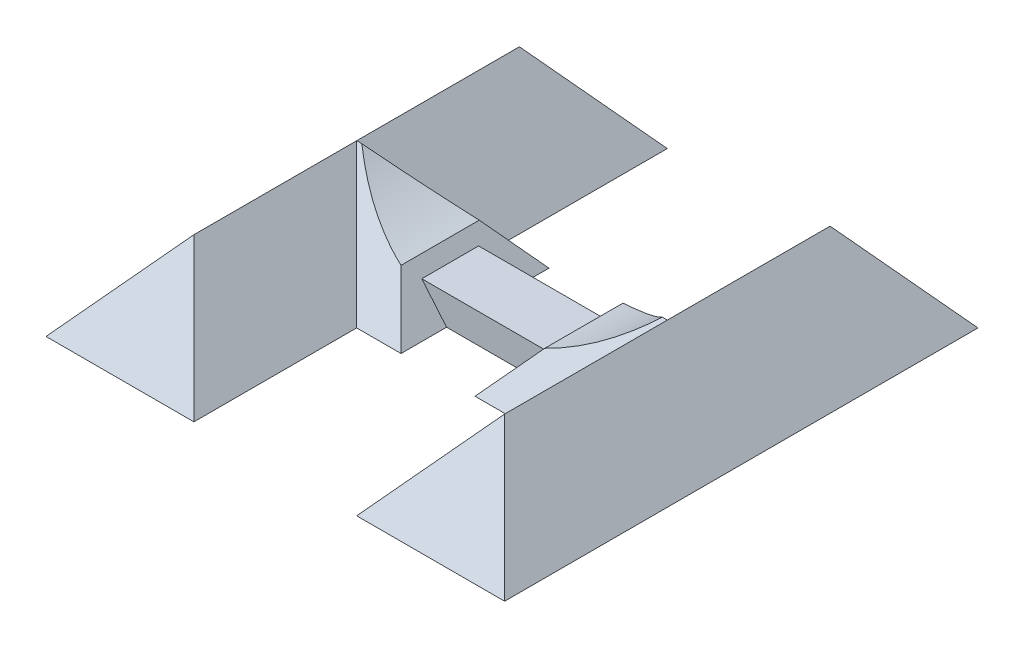
ISO-10303-21;
HEADER;
FILE_DESCRIPTION(('STEP AP214'),'2;1');
FILE_NAME('part.step','',(''),(''),'','','');
FILE_SCHEMA(('AUTOMOTIVE_DESIGN { 1 0 10303 214 1 1 1 1 }'));
ENDSEC;
DATA;
#1=APPLICATION_CONTEXT('core data for automotive mechanical design processes');
#2=APPLICATION_PROTOCOL_DEFINITION('international standard','automotive_design',2000,#1);
#3=PRODUCT_CONTEXT('',#1,'mechanical');
#4=PRODUCT('Part','Part','',(#3));
#5=PRODUCT_RELATED_PRODUCT_CATEGORY('part','',(#4));
#6=PRODUCT_DEFINITION_FORMATION('','',#4);
#7=PRODUCT_DEFINITION_CONTEXT('part definition',#1,'design');
#8=PRODUCT_DEFINITION('design','',#6,#7);
#9=PRODUCT_DEFINITION_SHAPE('','',#8);
#10=(LENGTH_UNIT() NAMED_UNIT(*) SI_UNIT(.MILLI.,.METRE.));
#11=(NAMED_UNIT(*) PLANE_ANGLE_UNIT() SI_UNIT($,.RADIAN.));
#12=(NAMED_UNIT(*) SI_UNIT($,.STERADIAN.) SOLID_ANGLE_UNIT());
#13=UNCERTAINTY_MEASURE_WITH_UNIT(LENGTH_MEASURE(1.E-05),#10,'distance_accuracy_value','');
#14=(GEOMETRIC_REPRESENTATION_CONTEXT(3) GLOBAL_UNCERTAINTY_ASSIGNED_CONTEXT((#13)) GLOBAL_UNIT_ASSIGNED_CONTEXT((#10,
#11,#12)) REPRESENTATION_CONTEXT('',''));
#15=CARTESIAN_POINT('',(0.,0.,0.));
#16=DIRECTION('',(0.,0.,1.));
#17=DIRECTION('',(1.,0.,0.));
#18=AXIS2_PLACEMENT_3D('',#15,#16,#17);
#19=CARTESIAN_POINT('',(0.,0.,-105.));
#20=DIRECTION('',(0.,0.64278760968654,-0.766044443118977));
#21=DIRECTION('',(0.,0.766044443118977,0.64278760968654));
#22=AXIS2_PLACEMENT_3D('',#19,#20,#21);
#23=PLANE('',#22);
#24=DIRECTION('',(-1.,0.,0.));
#25=VECTOR('',#24,1.);
#26=CARTESIAN_POINT('',(0.,0.,-105.));
#27=LINE('',#26,#25);
#28=CARTESIAN_POINT('',(65.,0.,-105.));
#29=VERTEX_POINT('',#28);
#30=CARTESIAN_POINT('',(15.,0.,-105.));
#31=VERTEX_POINT('',#30);
#32=EDGE_CURVE('E211',#29,#31,#27,.T.);
#33=ORIENTED_EDGE('',*,*,#32,.T.);
#34=DIRECTION('',(-0.540716203060938,-0.644400477571771,-0.540716203060937));
#35=VECTOR('',#34,1.);
#36=CARTESIAN_POINT('',(45.6992712865269,36.5859668457426,-74.3007287134731));
#37=LINE('',#36,#35);
#38=CARTESIAN_POINT('',(40.,29.7938398148552,-80.));
#39=VERTEX_POINT('',#38);
#40=EDGE_CURVE('E237',#39,#31,#37,.T.);
#41=ORIENTED_EDGE('',*,*,#40,.F.);
#42=DIRECTION('',(-0.540716203060937,0.64440047757177,0.540716203060937));
#43=VECTOR('',#42,1.);
#44=CARTESIAN_POINT('',(34.3007287134731,36.5859668457426,-74.3007287134731));
#45=LINE('',#44,#43);
#46=EDGE_CURVE('E236',#39,#29,#45,.F.);
#47=ORIENTED_EDGE('',*,*,#46,.T.);
#48=EDGE_LOOP('',(#33,#41,#47));
#49=FACE_BOUND('',#48,.T.);
#50=ADVANCED_FACE('F35',(#49),#23,.T.);
#51=CARTESIAN_POINT('',(15.,0.,0.));
#52=DIRECTION('',(-0.766044443118977,0.64278760968654,0.));
#53=DIRECTION('',(-0.64278760968654,-0.766044443118977,0.));
#54=AXIS2_PLACEMENT_3D('',#51,#52,#53);
#55=PLANE('',#54);
#56=DIRECTION('',(0.540716203060938,0.644400477571771,0.540716203060937));
#57=VECTOR('',#56,1.);
#58=CARTESIAN_POINT('',(10.6143898162104,-5.22656669224894,-54.3856101837896));
#59=LINE('',#58,#57);
#60=CARTESIAN_POINT('',(40.,29.7938398148551,-25.));
#61=VERTEX_POINT('',#60);
#62=CARTESIAN_POINT('',(15.,0.,-50.));
#63=VERTEX_POINT('',#62);
#64=EDGE_CURVE('E241',#61,#63,#59,.F.);
#65=ORIENTED_EDGE('',*,*,#64,.F.);
#66=DIRECTION('',(0.,0.,1.));
#67=VECTOR('',#66,1.);
#68=CARTESIAN_POINT('',(40.,29.7938398148551,0.));
#69=LINE('',#68,#67);
#70=EDGE_CURVE('E258',#61,#39,#69,.F.);
#71=ORIENTED_EDGE('',*,*,#70,.T.);
#72=ORIENTED_EDGE('',*,*,#40,.T.);
#73=DIRECTION('',(0.,0.,1.));
#74=VECTOR('',#73,1.);
#75=CARTESIAN_POINT('',(15.,0.,0.));
#76=LINE('',#75,#74);
#77=EDGE_CURVE('E214',#31,#63,#76,.T.);
#78=ORIENTED_EDGE('',*,*,#77,.T.);
#79=EDGE_LOOP('',(#65,#71,#72,#78));
#80=FACE_BOUND('',#79,.T.);
#81=ADVANCED_FACE('F37',(#80),#55,.T.);
#82=CARTESIAN_POINT('',(0.,0.,-50.));
#83=DIRECTION('',(0.,0.64278760968654,-0.766044443118977));
#84=DIRECTION('',(0.,0.766044443118977,0.64278760968654));
#85=AXIS2_PLACEMENT_3D('',#82,#83,#84);
#86=PLANE('',#85);
#87=CARTESIAN_POINT('',(-12.5028649917816,85.,21.323468650069));
#88=DIRECTION('',(0.,0.64278760968654,-0.766044443118977));
#89=DIRECTION('',(0.,0.766044443118977,0.64278760968654));
#90=AXIS2_PLACEMENT_3D('',#87,#88,#89);
#91=ELLIPSE('',#90,97.905546699921,75.);
#92=CARTESIAN_POINT('',(38.2640521650848,29.7938398148552,-25.));
#93=VERTEX_POINT('',#92);
#94=CARTESIAN_POINT('',(11.7811719756103,14.0402540269038,-38.2188280243897));
#95=VERTEX_POINT('',#94);
#96=EDGE_CURVE('E332',#93,#95,#91,.T.);
#97=ORIENTED_EDGE('',*,*,#96,.F.);
#98=DIRECTION('',(1.,0.,0.));
#99=VECTOR('',#98,1.);
#100=CARTESIAN_POINT('',(0.,29.7938398148552,-25.));
#101=LINE('',#100,#99);
#102=EDGE_CURVE('E240',#61,#93,#101,.F.);
#103=ORIENTED_EDGE('',*,*,#102,.F.);
#104=ORIENTED_EDGE('',*,*,#64,.T.);
#105=DIRECTION('',(1.,0.,0.));
#106=VECTOR('',#105,1.);
#107=CARTESIAN_POINT('',(0.,0.,-50.));
#108=LINE('',#107,#106);
#109=CARTESIAN_POINT('',(0.,0.,-50.));
#110=VERTEX_POINT('',#109);
#111=EDGE_CURVE('E217',#110,#63,#108,.T.);
#112=ORIENTED_EDGE('',*,*,#111,.F.);
#113=DIRECTION('',(-0.540716203060937,-0.644400477571771,-0.540716203060937));
#114=VECTOR('',#113,1.);
#115=CARTESIAN_POINT('',(14.6187006126319,17.4218889741631,-35.3812993873682));
#116=LINE('',#115,#114);
#117=EDGE_CURVE('E251',#95,#110,#116,.T.);
#118=ORIENTED_EDGE('',*,*,#117,.F.);
#119=EDGE_LOOP('',(#97,#103,#104,#112,#118));
#120=FACE_BOUND('',#119,.T.);
#121=ADVANCED_FACE('F347',(#120),#86,.T.);
#122=CARTESIAN_POINT('',(0.,0.,0.));
#123=DIRECTION('',(-0.766044443118977,0.64278760968654,0.));
#124=DIRECTION('',(-0.64278760968654,-0.766044443118977,0.));
#125=AXIS2_PLACEMENT_3D('',#122,#123,#124);
#126=PLANE('',#125);
#127=DIRECTION('',(0.,0.,1.));
#128=VECTOR('',#127,1.);
#129=CARTESIAN_POINT('',(11.7811719756103,14.0402540269038,-80.));
#130=LINE('',#129,#128);
#131=CARTESIAN_POINT('',(11.7811719756104,14.0402540269038,-11.7811719756104));
#132=VERTEX_POINT('',#131);
#133=EDGE_CURVE('E50',#95,#132,#130,.T.);
#134=ORIENTED_EDGE('',*,*,#133,.F.);
#135=ORIENTED_EDGE('',*,*,#117,.T.);
#136=DIRECTION('',(0.,0.,-1.));
#137=VECTOR('',#136,1.);
#138=CARTESIAN_POINT('',(0.,0.,0.));
#139=LINE('',#138,#137);
#140=CARTESIAN_POINT('',(0.,0.,-34.6036158794164));
#141=VERTEX_POINT('',#140);
#142=EDGE_CURVE('E220',#141,#110,#139,.T.);
#143=ORIENTED_EDGE('',*,*,#142,.F.);
#144=DIRECTION('',(-0.64278760968654,-0.766044443118977,0.));
#145=VECTOR('',#144,1.);
#146=CARTESIAN_POINT('',(0.,0.,-34.6036158794164));
#147=LINE('',#146,#145);
#148=CARTESIAN_POINT('',(8.39099631177282,10.,-34.6036158794164));
#149=VERTEX_POINT('',#148);
#150=EDGE_CURVE('E204',#149,#141,#147,.T.);
#151=ORIENTED_EDGE('',*,*,#150,.F.);
#152=DIRECTION('',(0.,0.,1.));
#153=VECTOR('',#152,1.);
#154=CARTESIAN_POINT('',(8.39099631177282,10.,0.));
#155=LINE('',#154,#153);
#156=CARTESIAN_POINT('',(8.39099631177283,10.,-15.3963841205836));
#157=VERTEX_POINT('',#156);
#158=EDGE_CURVE('E43',#149,#157,#155,.T.);
#159=ORIENTED_EDGE('',*,*,#158,.T.);
#160=DIRECTION('',(0.64278760968654,0.766044443118977,0.));
#161=VECTOR('',#160,1.);
#162=CARTESIAN_POINT('',(0.,0.,-15.3963841205836));
#163=LINE('',#162,#161);
#164=CARTESIAN_POINT('',(0.,0.,-15.3963841205836));
#165=VERTEX_POINT('',#164);
#166=EDGE_CURVE('E209',#165,#157,#163,.T.);
#167=ORIENTED_EDGE('',*,*,#166,.F.);
#168=CARTESIAN_POINT('',(0.,0.,0.));
#169=VERTEX_POINT('',#168);
#170=EDGE_CURVE('E221',#169,#165,#139,.T.);
#171=ORIENTED_EDGE('',*,*,#170,.F.);
#172=DIRECTION('',(0.540716203060937,0.644400477571771,-0.540716203060937));
#173=VECTOR('',#172,1.);
#174=CARTESIAN_POINT('',(0.,0.,0.));
#175=LINE('',#174,#173);
#176=EDGE_CURVE('E249',#132,#169,#175,.F.);
#177=ORIENTED_EDGE('',*,*,#176,.F.);
#178=EDGE_LOOP('',(#134,#135,#143,#151,#159,#167,#171,#177));
#179=FACE_BOUND('',#178,.T.);
#180=ADVANCED_FACE('F264',(#179),#126,.T.);
#181=CARTESIAN_POINT('',(0.,0.,0.));
#182=DIRECTION('',(0.,0.64278760968654,0.766044443118977));
#183=DIRECTION('',(0.,-0.766044443118977,0.64278760968654));
#184=AXIS2_PLACEMENT_3D('',#181,#182,#183);
#185=PLANE('',#184);
#186=ORIENTED_EDGE('',*,*,#102,.T.);
#187=CARTESIAN_POINT('',(-12.5028649917816,85.,-71.323468650069));
#188=DIRECTION('',(0.,0.64278760968654,0.766044443118977));
#189=DIRECTION('',(0.,-0.766044443118977,0.64278760968654));
#190=AXIS2_PLACEMENT_3D('',#187,#188,#189);
#191=ELLIPSE('',#190,97.905546699921,75.);
#192=EDGE_CURVE('E335',#93,#132,#191,.F.);
#193=ORIENTED_EDGE('',*,*,#192,.T.);
#194=ORIENTED_EDGE('',*,*,#176,.T.);
#195=DIRECTION('',(1.,0.,0.));
#196=VECTOR('',#195,1.);
#197=CARTESIAN_POINT('',(0.,0.,0.));
#198=LINE('',#197,#196);
#199=CARTESIAN_POINT('',(15.,0.,0.));
#200=VERTEX_POINT('',#199);
#201=EDGE_CURVE('E224',#169,#200,#198,.T.);
#202=ORIENTED_EDGE('',*,*,#201,.T.);
#203=DIRECTION('',(-0.540716203060937,-0.644400477571771,0.540716203060937));
#204=VECTOR('',#203,1.);
#205=CARTESIAN_POINT('',(10.6143898162104,-5.22656669224894,4.38561018378955));
#206=LINE('',#205,#204);
#207=EDGE_CURVE('E247',#61,#200,#206,.T.);
#208=ORIENTED_EDGE('',*,*,#207,.F.);
#209=EDGE_LOOP('',(#186,#193,#194,#202,#208));
#210=FACE_BOUND('',#209,.T.);
#211=ADVANCED_FACE('F339',(#210),#185,.T.);
#212=CARTESIAN_POINT('',(15.,0.,0.));
#213=DIRECTION('',(-0.766044443118977,0.64278760968654,0.));
#214=DIRECTION('',(-0.64278760968654,-0.766044443118977,0.));
#215=AXIS2_PLACEMENT_3D('',#212,#213,#214);
#216=PLANE('',#215);
#217=DIRECTION('',(0.,0.,-1.));
#218=VECTOR('',#217,1.);
#219=CARTESIAN_POINT('',(40.,29.7938398148551,0.));
#220=LINE('',#219,#218);
#221=CARTESIAN_POINT('',(40.,29.7938398148551,30.));
#222=VERTEX_POINT('',#221);
#223=EDGE_CURVE('E256',#61,#222,#220,.F.);
#224=ORIENTED_EDGE('',*,*,#223,.F.);
#225=ORIENTED_EDGE('',*,*,#207,.T.);
#226=DIRECTION('',(0.,0.,1.));
#227=VECTOR('',#226,1.);
#228=CARTESIAN_POINT('',(15.,0.,0.));
#229=LINE('',#228,#227);
#230=CARTESIAN_POINT('',(15.,0.,55.));
#231=VERTEX_POINT('',#230);
#232=EDGE_CURVE('E227',#200,#231,#229,.T.);
#233=ORIENTED_EDGE('',*,*,#232,.T.);
#234=DIRECTION('',(0.540716203060937,0.644400477571771,-0.540716203060938));
#235=VECTOR('',#234,1.);
#236=CARTESIAN_POINT('',(31.080570673895,19.1640778715794,38.919429326105));
#237=LINE('',#236,#235);
#238=EDGE_CURVE('E245',#222,#231,#237,.F.);
#239=ORIENTED_EDGE('',*,*,#238,.F.);
#240=EDGE_LOOP('',(#224,#225,#233,#239));
#241=FACE_BOUND('',#240,.T.);
#242=ADVANCED_FACE('F377',(#241),#216,.T.);
#243=CARTESIAN_POINT('',(0.,0.,55.));
#244=DIRECTION('',(0.,0.64278760968654,0.766044443118977));
#245=DIRECTION('',(0.,-0.766044443118977,0.64278760968654));
#246=AXIS2_PLACEMENT_3D('',#243,#244,#245);
#247=PLANE('',#246);
#248=DIRECTION('',(-1.,0.,0.));
#249=VECTOR('',#248,1.);
#250=CARTESIAN_POINT('',(0.,0.,55.));
#251=LINE('',#250,#249);
#252=CARTESIAN_POINT('',(65.,0.,55.));
#253=VERTEX_POINT('',#252);
#254=EDGE_CURVE('E230',#253,#231,#251,.T.);
#255=ORIENTED_EDGE('',*,*,#254,.F.);
#256=DIRECTION('',(0.540716203060937,-0.644400477571771,0.540716203060937));
#257=VECTOR('',#256,1.);
#258=CARTESIAN_POINT('',(48.9194293261049,19.1640778715794,38.919429326105));
#259=LINE('',#258,#257);
#260=EDGE_CURVE('E243',#222,#253,#259,.T.);
#261=ORIENTED_EDGE('',*,*,#260,.F.);
#262=ORIENTED_EDGE('',*,*,#238,.T.);
#263=EDGE_LOOP('',(#255,#261,#262));
#264=FACE_BOUND('',#263,.T.);
#265=ADVANCED_FACE('F373',(#264),#247,.T.);
#266=CARTESIAN_POINT('',(65.,0.,0.));
#267=DIRECTION('',(0.766044443118977,0.64278760968654,0.));
#268=DIRECTION('',(-0.64278760968654,0.766044443118977,0.));
#269=AXIS2_PLACEMENT_3D('',#266,#267,#268);
#270=PLANE('',#269);
#271=ORIENTED_EDGE('',*,*,#70,.F.);
#272=ORIENTED_EDGE('',*,*,#223,.T.);
#273=ORIENTED_EDGE('',*,*,#260,.T.);
#274=DIRECTION('',(0.,0.,1.));
#275=VECTOR('',#274,1.);
#276=CARTESIAN_POINT('',(65.,0.,0.));
#277=LINE('',#276,#275);
#278=EDGE_CURVE('E233',#29,#253,#277,.T.);
#279=ORIENTED_EDGE('',*,*,#278,.F.);
#280=ORIENTED_EDGE('',*,*,#46,.F.);
#281=EDGE_LOOP('',(#271,#272,#273,#279,#280));
#282=FACE_BOUND('',#281,.T.);
#283=ADVANCED_FACE('F370',(#282),#270,.T.);
#284=CARTESIAN_POINT('',(0.,0.,0.));
#285=DIRECTION('',(0.,1.,0.));
#286=DIRECTION('',(0.,0.,1.));
#287=AXIS2_PLACEMENT_3D('',#284,#285,#286);
#288=PLANE('',#287);
#289=ORIENTED_EDGE('',*,*,#170,.T.);
#290=DIRECTION('',(-1.,0.,0.));
#291=VECTOR('',#290,1.);
#292=CARTESIAN_POINT('',(-12.5028649917816,0.,-15.3963841205836));
#293=LINE('',#292,#291);
#294=CARTESIAN_POINT('',(-25.0057299835632,0.,-15.3963841205836));
#295=VERTEX_POINT('',#294);
#296=EDGE_CURVE('E202',#165,#295,#293,.T.);
#297=ORIENTED_EDGE('',*,*,#296,.T.);
#298=DIRECTION('',(0.,0.,-1.));
#299=VECTOR('',#298,1.);
#300=CARTESIAN_POINT('',(-25.0057299835632,0.,0.));
#301=LINE('',#300,#299);
#302=CARTESIAN_POINT('',(-25.0057299835632,0.,0.));
#303=VERTEX_POINT('',#302);
#304=EDGE_CURVE('E279',#303,#295,#301,.T.);
#305=ORIENTED_EDGE('',*,*,#304,.F.);
#306=DIRECTION('',(-1.,0.,0.));
#307=VECTOR('',#306,1.);
#308=CARTESIAN_POINT('',(-25.0057299835632,0.,0.));
#309=LINE('',#308,#307);
#310=CARTESIAN_POINT('',(-40.0057299835632,0.,0.));
#311=VERTEX_POINT('',#310);
#312=EDGE_CURVE('E175',#303,#311,#309,.T.);
#313=ORIENTED_EDGE('',*,*,#312,.T.);
#314=DIRECTION('',(0.,0.,1.));
#315=VECTOR('',#314,1.);
#316=CARTESIAN_POINT('',(-40.0057299835632,0.,0.));
#317=LINE('',#316,#315);
#318=CARTESIAN_POINT('',(-40.0057299835632,0.,55.));
#319=VERTEX_POINT('',#318);
#320=EDGE_CURVE('E283',#311,#319,#317,.T.);
#321=ORIENTED_EDGE('',*,*,#320,.T.);
#322=DIRECTION('',(1.,0.,0.));
#323=VECTOR('',#322,1.);
#324=CARTESIAN_POINT('',(-25.0057299835632,0.,55.));
#325=LINE('',#324,#323);
#326=CARTESIAN_POINT('',(-90.0057299835632,0.,55.));
#327=VERTEX_POINT('',#326);
#328=EDGE_CURVE('E291',#327,#319,#325,.T.);
#329=ORIENTED_EDGE('',*,*,#328,.F.);
#330=DIRECTION('',(0.,0.,1.));
#331=VECTOR('',#330,1.);
#332=CARTESIAN_POINT('',(-90.0057299835631,0.,0.));
#333=LINE('',#332,#331);
#334=CARTESIAN_POINT('',(-90.0057299835631,0.,-105.));
#335=VERTEX_POINT('',#334);
#336=EDGE_CURVE('E293',#335,#327,#333,.T.);
#337=ORIENTED_EDGE('',*,*,#336,.F.);
#338=DIRECTION('',(1.,0.,0.));
#339=VECTOR('',#338,1.);
#340=CARTESIAN_POINT('',(-25.0057299835631,0.,-105.));
#341=LINE('',#340,#339);
#342=CARTESIAN_POINT('',(-40.0057299835631,0.,-105.));
#343=VERTEX_POINT('',#342);
#344=EDGE_CURVE('E325',#335,#343,#341,.T.);
#345=ORIENTED_EDGE('',*,*,#344,.T.);
#346=DIRECTION('',(0.,0.,1.));
#347=VECTOR('',#346,1.);
#348=CARTESIAN_POINT('',(-40.0057299835632,0.,0.));
#349=LINE('',#348,#347);
#350=CARTESIAN_POINT('',(-40.0057299835631,0.,-50.));
#351=VERTEX_POINT('',#350);
#352=EDGE_CURVE('E322',#343,#351,#349,.T.);
#353=ORIENTED_EDGE('',*,*,#352,.T.);
#354=DIRECTION('',(-1.,0.,0.));
#355=VECTOR('',#354,1.);
#356=CARTESIAN_POINT('',(-25.0057299835631,0.,-50.));
#357=LINE('',#356,#355);
#358=CARTESIAN_POINT('',(-25.0057299835631,0.,-50.));
#359=VERTEX_POINT('',#358);
#360=EDGE_CURVE('E285',#359,#351,#357,.T.);
#361=ORIENTED_EDGE('',*,*,#360,.F.);
#362=CARTESIAN_POINT('',(-25.0057299835632,0.,-34.6036158794164));
#363=VERTEX_POINT('',#362);
#364=EDGE_CURVE('E281',#363,#359,#301,.T.);
#365=ORIENTED_EDGE('',*,*,#364,.F.);
#366=DIRECTION('',(1.,0.,0.));
#367=VECTOR('',#366,1.);
#368=CARTESIAN_POINT('',(-12.5028649917816,0.,-34.6036158794164));
#369=LINE('',#368,#367);
#370=EDGE_CURVE('E198',#363,#141,#369,.T.);
#371=ORIENTED_EDGE('',*,*,#370,.T.);
#372=ORIENTED_EDGE('',*,*,#142,.T.);
#373=ORIENTED_EDGE('',*,*,#111,.T.);
#374=ORIENTED_EDGE('',*,*,#77,.F.);
#375=ORIENTED_EDGE('',*,*,#32,.F.);
#376=ORIENTED_EDGE('',*,*,#278,.T.);
#377=ORIENTED_EDGE('',*,*,#254,.T.);
#378=ORIENTED_EDGE('',*,*,#232,.F.);
#379=ORIENTED_EDGE('',*,*,#201,.F.);
#380=EDGE_LOOP('',(#289,#297,#305,#313,#321,#329,#337,#345,#353,#361,#365,#371,#372,#373,#374,
#375,#376,#377,#378,#379));
#381=FACE_BOUND('',#380,.T.);
#382=ADVANCED_FACE('F278',(#381),#288,.F.);
#383=CARTESIAN_POINT('',(-12.5028649917816,10.,-15.3963841205836));
#384=DIRECTION('',(0.,0.,1.));
#385=DIRECTION('',(1.,0.,0.));
#386=AXIS2_PLACEMENT_3D('',#383,#384,#385);
#387=PLANE('',#386);
#388=ORIENTED_EDGE('',*,*,#296,.F.);
#389=ORIENTED_EDGE('',*,*,#166,.T.);
#390=DIRECTION('',(-1.,0.,0.));
#391=VECTOR('',#390,1.);
#392=CARTESIAN_POINT('',(-12.5028649917816,10.,-15.3963841205836));
#393=LINE('',#392,#391);
#394=CARTESIAN_POINT('',(-33.396726295336,10.,-15.3963841205836));
#395=VERTEX_POINT('',#394);
#396=EDGE_CURVE('E201',#157,#395,#393,.T.);
#397=ORIENTED_EDGE('',*,*,#396,.T.);
#398=DIRECTION('',(-0.64278760968654,0.766044443118977,0.));
#399=VECTOR('',#398,1.);
#400=CARTESIAN_POINT('',(-25.0057299835632,0.,-15.3963841205836));
#401=LINE('',#400,#399);
#402=EDGE_CURVE('E276',#295,#395,#401,.T.);
#403=ORIENTED_EDGE('',*,*,#402,.F.);
#404=EDGE_LOOP('',(#388,#389,#397,#403));
#405=FACE_BOUND('',#404,.T.);
#406=ADVANCED_FACE('F275',(#405),#387,.T.);
#407=CARTESIAN_POINT('',(-12.5028649917816,10.,-34.6036158794164));
#408=DIRECTION('',(0.,0.,-1.));
#409=DIRECTION('',(-1.,0.,0.));
#410=AXIS2_PLACEMENT_3D('',#407,#408,#409);
#411=PLANE('',#410);
#412=DIRECTION('',(1.,0.,0.));
#413=VECTOR('',#412,1.);
#414=CARTESIAN_POINT('',(-12.5028649917816,10.,-34.6036158794164));
#415=LINE('',#414,#413);
#416=CARTESIAN_POINT('',(-33.396726295336,10.,-34.6036158794164));
#417=VERTEX_POINT('',#416);
#418=EDGE_CURVE('E199',#417,#149,#415,.T.);
#419=ORIENTED_EDGE('',*,*,#418,.T.);
#420=ORIENTED_EDGE('',*,*,#150,.T.);
#421=ORIENTED_EDGE('',*,*,#370,.F.);
#422=DIRECTION('',(0.64278760968654,-0.766044443118977,0.));
#423=VECTOR('',#422,1.);
#424=CARTESIAN_POINT('',(-25.0057299835632,0.,-34.6036158794164));
#425=LINE('',#424,#423);
#426=EDGE_CURVE('E329',#417,#363,#425,.T.);
#427=ORIENTED_EDGE('',*,*,#426,.F.);
#428=EDGE_LOOP('',(#419,#420,#421,#427));
#429=FACE_BOUND('',#428,.T.);
#430=ADVANCED_FACE('F351',(#429),#411,.T.);
#431=CARTESIAN_POINT('',(0.,10.,0.));
#432=DIRECTION('',(0.,-1.,0.));
#433=DIRECTION('',(0.,0.,-1.));
#434=AXIS2_PLACEMENT_3D('',#431,#432,#433);
#435=PLANE('',#434);
#436=ORIENTED_EDGE('',*,*,#158,.F.);
#437=ORIENTED_EDGE('',*,*,#418,.F.);
#438=DIRECTION('',(0.,0.,1.));
#439=VECTOR('',#438,1.);
#440=CARTESIAN_POINT('',(-33.396726295336,10.,0.));
#441=LINE('',#440,#439);
#442=EDGE_CURVE('E195',#417,#395,#441,.T.);
#443=ORIENTED_EDGE('',*,*,#442,.T.);
#444=ORIENTED_EDGE('',*,*,#396,.F.);
#445=EDGE_LOOP('',(#436,#437,#443,#444));
#446=FACE_BOUND('',#445,.T.);
#447=ADVANCED_FACE('F269',(#446),#435,.F.);
#448=CARTESIAN_POINT('',(-25.0057299835631,0.,-105.));
#449=DIRECTION('',(0.,0.64278760968654,-0.766044443118977));
#450=DIRECTION('',(0.,0.766044443118977,0.64278760968654));
#451=AXIS2_PLACEMENT_3D('',#448,#449,#450);
#452=PLANE('',#451);
#453=ORIENTED_EDGE('',*,*,#344,.F.);
#454=DIRECTION('',(0.540716203060937,0.64440047757177,0.540716203060938));
#455=VECTOR('',#454,1.);
#456=CARTESIAN_POINT('',(-59.3064586970362,36.5859668457426,-74.3007287134731));
#457=LINE('',#456,#455);
#458=CARTESIAN_POINT('',(-65.0057299835631,29.7938398148552,-80.));
#459=VERTEX_POINT('',#458);
#460=EDGE_CURVE('E295',#459,#335,#457,.F.);
#461=ORIENTED_EDGE('',*,*,#460,.F.);
#462=DIRECTION('',(0.540716203060938,-0.644400477571771,-0.540716203060937));
#463=VECTOR('',#462,1.);
#464=CARTESIAN_POINT('',(-70.70500127009,36.5859668457426,-74.3007287134731));
#465=LINE('',#464,#463);
#466=EDGE_CURVE('E187',#459,#343,#465,.T.);
#467=ORIENTED_EDGE('',*,*,#466,.T.);
#468=EDGE_LOOP('',(#453,#461,#467));
#469=FACE_BOUND('',#468,.T.);
#470=ADVANCED_FACE('F358',(#469),#452,.T.);
#471=CARTESIAN_POINT('',(-40.0057299835632,0.,0.));
#472=DIRECTION('',(0.766044443118977,0.64278760968654,0.));
#473=DIRECTION('',(0.64278760968654,-0.766044443118977,0.));
#474=AXIS2_PLACEMENT_3D('',#471,#472,#473);
#475=PLANE('',#474);
#476=DIRECTION('',(-0.540716203060938,0.644400477571771,0.540716203060937));
#477=VECTOR('',#476,1.);
#478=CARTESIAN_POINT('',(-35.6201197997736,-5.22656669224894,-54.3856101837896));
#479=LINE('',#478,#477);
#480=CARTESIAN_POINT('',(-65.0057299835631,29.7938398148551,-25.));
#481=VERTEX_POINT('',#480);
#482=EDGE_CURVE('E179',#481,#351,#479,.F.);
#483=ORIENTED_EDGE('',*,*,#482,.T.);
#484=ORIENTED_EDGE('',*,*,#352,.F.);
#485=ORIENTED_EDGE('',*,*,#466,.F.);
#486=DIRECTION('',(0.,0.,1.));
#487=VECTOR('',#486,1.);
#488=CARTESIAN_POINT('',(-65.0057299835632,29.7938398148551,0.));
#489=LINE('',#488,#487);
#490=EDGE_CURVE('E193',#481,#459,#489,.F.);
#491=ORIENTED_EDGE('',*,*,#490,.F.);
#492=EDGE_LOOP('',(#483,#484,#485,#491));
#493=FACE_BOUND('',#492,.T.);
#494=ADVANCED_FACE('F315',(#493),#475,.T.);
#495=CARTESIAN_POINT('',(-25.0057299835631,0.,-50.));
#496=DIRECTION('',(0.,0.64278760968654,-0.766044443118977));
#497=DIRECTION('',(0.,0.766044443118977,0.64278760968654));
#498=AXIS2_PLACEMENT_3D('',#495,#496,#497);
#499=PLANE('',#498);
#500=CARTESIAN_POINT('',(-12.5028649917816,85.,21.323468650069));
#501=DIRECTION('',(0.,0.64278760968654,-0.766044443118977));
#502=DIRECTION('',(0.,0.766044443118977,0.64278760968654));
#503=AXIS2_PLACEMENT_3D('',#500,#501,#502);
#504=ELLIPSE('',#503,97.905546699921,75.);
#505=CARTESIAN_POINT('',(-36.7869019591735,14.0402540269038,-38.2188280243897));
#506=VERTEX_POINT('',#505);
#507=CARTESIAN_POINT('',(-63.2697821486479,29.7938398148552,-25.));
#508=VERTEX_POINT('',#507);
#509=EDGE_CURVE('E58',#506,#508,#504,.T.);
#510=ORIENTED_EDGE('',*,*,#509,.F.);
#511=DIRECTION('',(0.540716203060938,-0.644400477571771,-0.540716203060937));
#512=VECTOR('',#511,1.);
#513=CARTESIAN_POINT('',(-39.624430596195,17.4218889741631,-35.3812993873682));
#514=LINE('',#513,#512);
#515=EDGE_CURVE('E170',#506,#359,#514,.T.);
#516=ORIENTED_EDGE('',*,*,#515,.T.);
#517=ORIENTED_EDGE('',*,*,#360,.T.);
#518=ORIENTED_EDGE('',*,*,#482,.F.);
#519=DIRECTION('',(-1.,0.,0.));
#520=VECTOR('',#519,1.);
#521=CARTESIAN_POINT('',(-25.0057299835632,29.7938398148552,-25.));
#522=LINE('',#521,#520);
#523=EDGE_CURVE('E188',#481,#508,#522,.F.);
#524=ORIENTED_EDGE('',*,*,#523,.T.);
#525=EDGE_LOOP('',(#510,#516,#517,#518,#524));
#526=FACE_BOUND('',#525,.T.);
#527=ADVANCED_FACE('F318',(#526),#499,.T.);
#528=CARTESIAN_POINT('',(-25.0057299835632,0.,0.));
#529=DIRECTION('',(0.766044443118977,0.64278760968654,0.));
#530=DIRECTION('',(0.64278760968654,-0.766044443118977,0.));
#531=AXIS2_PLACEMENT_3D('',#528,#529,#530);
#532=PLANE('',#531);
#533=DIRECTION('',(0.,0.,1.));
#534=VECTOR('',#533,1.);
#535=CARTESIAN_POINT('',(-36.7869019591735,14.0402540269038,-80.));
#536=LINE('',#535,#534);
#537=CARTESIAN_POINT('',(-36.7869019591735,14.0402540269038,-11.7811719756104));
#538=VERTEX_POINT('',#537);
#539=EDGE_CURVE('E158',#538,#506,#536,.F.);
#540=ORIENTED_EDGE('',*,*,#539,.F.);
#541=DIRECTION('',(-0.540716203060937,0.644400477571771,-0.540716203060938));
#542=VECTOR('',#541,1.);
#543=CARTESIAN_POINT('',(-25.0057299835632,0.,0.));
#544=LINE('',#543,#542);
#545=EDGE_CURVE('E167',#538,#303,#544,.F.);
#546=ORIENTED_EDGE('',*,*,#545,.T.);
#547=ORIENTED_EDGE('',*,*,#304,.T.);
#548=ORIENTED_EDGE('',*,*,#402,.T.);
#549=ORIENTED_EDGE('',*,*,#442,.F.);
#550=ORIENTED_EDGE('',*,*,#426,.T.);
#551=ORIENTED_EDGE('',*,*,#364,.T.);
#552=ORIENTED_EDGE('',*,*,#515,.F.);
#553=EDGE_LOOP('',(#540,#546,#547,#548,#549,#550,#551,#552));
#554=FACE_BOUND('',#553,.T.);
#555=ADVANCED_FACE('F165',(#554),#532,.T.);
#556=CARTESIAN_POINT('',(-25.0057299835632,0.,0.));
#557=DIRECTION('',(0.,0.64278760968654,0.766044443118977));
#558=DIRECTION('',(0.,-0.766044443118977,0.64278760968654));
#559=AXIS2_PLACEMENT_3D('',#556,#557,#558);
#560=PLANE('',#559);
#561=ORIENTED_EDGE('',*,*,#545,.F.);
#562=CARTESIAN_POINT('',(-12.5028649917816,85.,-71.323468650069));
#563=DIRECTION('',(0.,0.64278760968654,0.766044443118977));
#564=DIRECTION('',(0.,-0.766044443118977,0.64278760968654));
#565=AXIS2_PLACEMENT_3D('',#562,#563,#564);
#566=ELLIPSE('',#565,97.905546699921,75.);
#567=EDGE_CURVE('E11',#538,#508,#566,.F.);
#568=ORIENTED_EDGE('',*,*,#567,.T.);
#569=ORIENTED_EDGE('',*,*,#523,.F.);
#570=DIRECTION('',(0.540716203060937,-0.644400477571771,0.540716203060938));
#571=VECTOR('',#570,1.);
#572=CARTESIAN_POINT('',(-35.6201197997736,-5.22656669224894,4.38561018378955));
#573=LINE('',#572,#571);
#574=EDGE_CURVE('E177',#481,#311,#573,.T.);
#575=ORIENTED_EDGE('',*,*,#574,.T.);
#576=ORIENTED_EDGE('',*,*,#312,.F.);
#577=EDGE_LOOP('',(#561,#568,#569,#575,#576));
#578=FACE_BOUND('',#577,.T.);
#579=ADVANCED_FACE('F172',(#578),#560,.T.);
#580=CARTESIAN_POINT('',(-40.0057299835632,0.,0.));
#581=DIRECTION('',(0.766044443118977,0.64278760968654,0.));
#582=DIRECTION('',(0.64278760968654,-0.766044443118977,0.));
#583=AXIS2_PLACEMENT_3D('',#580,#581,#582);
#584=PLANE('',#583);
#585=DIRECTION('',(0.,0.,-1.));
#586=VECTOR('',#585,1.);
#587=CARTESIAN_POINT('',(-65.0057299835631,29.7938398148551,0.));
#588=LINE('',#587,#586);
#589=CARTESIAN_POINT('',(-65.0057299835632,29.7938398148551,30.));
#590=VERTEX_POINT('',#589);
#591=EDGE_CURVE('E190',#481,#590,#588,.F.);
#592=ORIENTED_EDGE('',*,*,#591,.T.);
#593=DIRECTION('',(-0.540716203060937,0.644400477571771,-0.540716203060938));
#594=VECTOR('',#593,1.);
#595=CARTESIAN_POINT('',(-56.0863006574582,19.1640778715794,38.919429326105));
#596=LINE('',#595,#594);
#597=EDGE_CURVE('E181',#590,#319,#596,.F.);
#598=ORIENTED_EDGE('',*,*,#597,.T.);
#599=ORIENTED_EDGE('',*,*,#320,.F.);
#600=ORIENTED_EDGE('',*,*,#574,.F.);
#601=EDGE_LOOP('',(#592,#598,#599,#600));
#602=FACE_BOUND('',#601,.T.);
#603=ADVANCED_FACE('F305',(#602),#584,.T.);
#604=CARTESIAN_POINT('',(-25.0057299835632,0.,55.));
#605=DIRECTION('',(0.,0.64278760968654,0.766044443118977));
#606=DIRECTION('',(0.,-0.766044443118977,0.64278760968654));
#607=AXIS2_PLACEMENT_3D('',#604,#605,#606);
#608=PLANE('',#607);
#609=ORIENTED_EDGE('',*,*,#328,.T.);
#610=ORIENTED_EDGE('',*,*,#597,.F.);
#611=DIRECTION('',(-0.540716203060938,-0.644400477571771,0.540716203060937));
#612=VECTOR('',#611,1.);
#613=CARTESIAN_POINT('',(-73.9251593096681,19.1640778715794,38.919429326105));
#614=LINE('',#613,#612);
#615=EDGE_CURVE('E300',#590,#327,#614,.T.);
#616=ORIENTED_EDGE('',*,*,#615,.T.);
#617=EDGE_LOOP('',(#609,#610,#616));
#618=FACE_BOUND('',#617,.T.);
#619=ADVANCED_FACE('F308',(#618),#608,.T.);
#620=CARTESIAN_POINT('',(-90.0057299835631,0.,0.));
#621=DIRECTION('',(-0.766044443118977,0.64278760968654,0.));
#622=DIRECTION('',(0.64278760968654,0.766044443118977,0.));
#623=AXIS2_PLACEMENT_3D('',#620,#621,#622);
#624=PLANE('',#623);
#625=ORIENTED_EDGE('',*,*,#490,.T.);
#626=ORIENTED_EDGE('',*,*,#460,.T.);
#627=ORIENTED_EDGE('',*,*,#336,.T.);
#628=ORIENTED_EDGE('',*,*,#615,.F.);
#629=ORIENTED_EDGE('',*,*,#591,.F.);
#630=EDGE_LOOP('',(#625,#626,#627,#628,#629));
#631=FACE_BOUND('',#630,.T.);
#632=ADVANCED_FACE('F478',(#631),#624,.T.);
#633=CARTESIAN_POINT('',(-12.5028649917816,85.,-80.));
#634=DIRECTION('',(0.,0.,1.));
#635=DIRECTION('',(1.,0.,0.));
#636=AXIS2_PLACEMENT_3D('',#633,#634,#635);
#637=CYLINDRICAL_SURFACE('',#636,75.);
#638=ORIENTED_EDGE('',*,*,#509,.T.);
#639=ORIENTED_EDGE('',*,*,#567,.F.);
#640=ORIENTED_EDGE('',*,*,#539,.T.);
#641=EDGE_LOOP('',(#638,#639,#640));
#642=FACE_BOUND('',#641,.T.);
#643=ADVANCED_FACE('F157',(#642),#637,.F.);
#644=ORIENTED_EDGE('',*,*,#96,.T.);
#645=ORIENTED_EDGE('',*,*,#133,.T.);
#646=ORIENTED_EDGE('',*,*,#192,.F.);
#647=EDGE_LOOP('',(#644,#645,#646));
#648=FACE_BOUND('',#647,.T.);
#649=ADVANCED_FACE('F477',(#648),#637,.F.);
#650=CLOSED_SHELL('',(#50,#81,#121,#180,#211,#242,#265,#283,#382,#406,#430,#447,#470,#494,#527,
#555,#579,#603,#619,#632,#643,#649));
#651=MANIFOLD_SOLID_BREP('B2',#650);
#652=ADVANCED_BREP_SHAPE_REPRESENTATION('',(#18,#651),#14);
#653=SHAPE_DEFINITION_REPRESENTATION(#9,#652);
ENDSEC;
END-ISO-10303-21;
